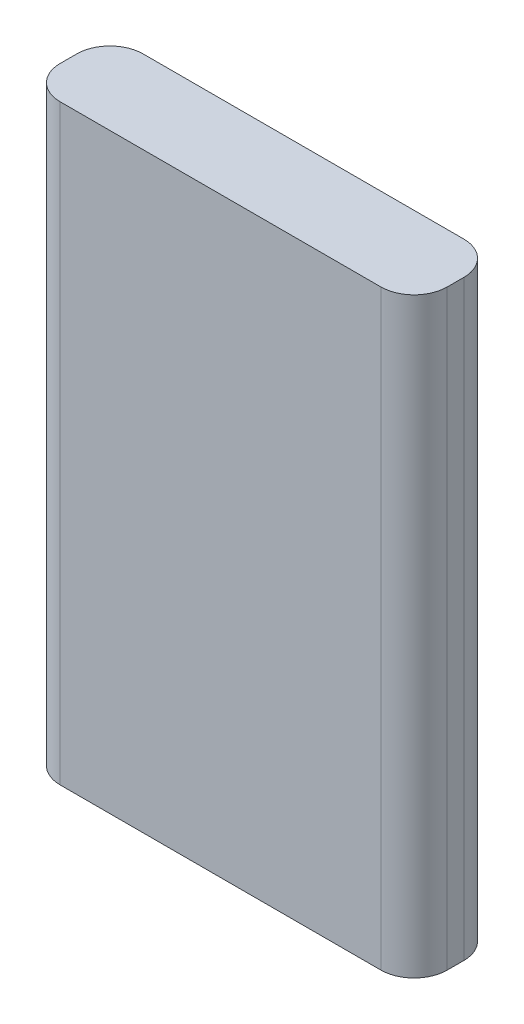
ISO-10303-21;
HEADER;
FILE_DESCRIPTION(('STEP AP214'),'2;1');
FILE_NAME('part.step','',(''),(''),'','','');
FILE_SCHEMA(('AUTOMOTIVE_DESIGN { 1 0 10303 214 1 1 1 1 }'));
ENDSEC;
DATA;
#1=APPLICATION_CONTEXT('core data for automotive mechanical design processes');
#2=APPLICATION_PROTOCOL_DEFINITION('international standard','automotive_design',2000,#1);
#3=PRODUCT_CONTEXT('',#1,'mechanical');
#4=PRODUCT('Part','Part','',(#3));
#5=PRODUCT_RELATED_PRODUCT_CATEGORY('part','',(#4));
#6=PRODUCT_DEFINITION_FORMATION('','',#4);
#7=PRODUCT_DEFINITION_CONTEXT('part definition',#1,'design');
#8=PRODUCT_DEFINITION('design','',#6,#7);
#9=PRODUCT_DEFINITION_SHAPE('','',#8);
#10=(LENGTH_UNIT() NAMED_UNIT(*) SI_UNIT(.MILLI.,.METRE.));
#11=(NAMED_UNIT(*) PLANE_ANGLE_UNIT() SI_UNIT($,.RADIAN.));
#12=(NAMED_UNIT(*) SI_UNIT($,.STERADIAN.) SOLID_ANGLE_UNIT());
#13=UNCERTAINTY_MEASURE_WITH_UNIT(LENGTH_MEASURE(1.E-05),#10,'distance_accuracy_value','');
#14=(GEOMETRIC_REPRESENTATION_CONTEXT(3) GLOBAL_UNCERTAINTY_ASSIGNED_CONTEXT((#13)) GLOBAL_UNIT_ASSIGNED_CONTEXT((#10,
#11,#12)) REPRESENTATION_CONTEXT('',''));
#15=CARTESIAN_POINT('',(0.,0.,0.));
#16=DIRECTION('',(0.,0.,1.));
#17=DIRECTION('',(1.,0.,0.));
#18=AXIS2_PLACEMENT_3D('',#15,#16,#17);
#19=CARTESIAN_POINT('',(-17.5,-26.75,7.5));
#20=DIRECTION('',(1.,0.,0.));
#21=DIRECTION('',(0.,0.,-1.));
#22=AXIS2_PLACEMENT_3D('',#19,#20,#21);
#23=PLANE('',#22);
#24=DIRECTION('',(0.,0.,-1.));
#25=VECTOR('',#24,1.);
#26=CARTESIAN_POINT('',(-17.5,26.75,7.5));
#27=LINE('',#26,#25);
#28=CARTESIAN_POINT('',(-17.5,26.75,4.5));
#29=VERTEX_POINT('',#28);
#30=CARTESIAN_POINT('',(-17.5,26.75,3.));
#31=VERTEX_POINT('',#30);
#32=EDGE_CURVE('E187',#29,#31,#27,.T.);
#33=ORIENTED_EDGE('',*,*,#32,.T.);
#34=DIRECTION('',(0.,-1.,0.));
#35=VECTOR('',#34,1.);
#36=CARTESIAN_POINT('',(-17.5,-26.75,3.));
#37=LINE('',#36,#35);
#38=CARTESIAN_POINT('',(-17.5,-26.75,3.));
#39=VERTEX_POINT('',#38);
#40=EDGE_CURVE('E126',#31,#39,#37,.T.);
#41=ORIENTED_EDGE('',*,*,#40,.T.);
#42=DIRECTION('',(0.,0.,-1.));
#43=VECTOR('',#42,1.);
#44=CARTESIAN_POINT('',(-17.5,-26.75,7.5));
#45=LINE('',#44,#43);
#46=CARTESIAN_POINT('',(-17.5,-26.75,4.5));
#47=VERTEX_POINT('',#46);
#48=EDGE_CURVE('E109',#47,#39,#45,.T.);
#49=ORIENTED_EDGE('',*,*,#48,.F.);
#50=DIRECTION('',(0.,-1.,0.));
#51=VECTOR('',#50,1.);
#52=CARTESIAN_POINT('',(-17.5,26.75,4.5));
#53=LINE('',#52,#51);
#54=EDGE_CURVE('E123',#47,#29,#53,.F.);
#55=ORIENTED_EDGE('',*,*,#54,.T.);
#56=EDGE_LOOP('',(#33,#41,#49,#55));
#57=FACE_BOUND('',#56,.T.);
#58=ADVANCED_FACE('F39',(#57),#23,.F.);
#59=CARTESIAN_POINT('',(17.5,-26.75,7.5));
#60=DIRECTION('',(0.,1.,0.));
#61=DIRECTION('',(-1.,0.,0.));
#62=AXIS2_PLACEMENT_3D('',#59,#60,#61);
#63=PLANE('',#62);
#64=ORIENTED_EDGE('',*,*,#48,.T.);
#65=CARTESIAN_POINT('',(-14.5,-26.75,3.));
#66=DIRECTION('',(0.,1.,0.));
#67=DIRECTION('',(-1.,0.,0.));
#68=AXIS2_PLACEMENT_3D('',#65,#66,#67);
#69=CIRCLE('',#68,3.);
#70=CARTESIAN_POINT('',(-14.5,-26.75,0.));
#71=VERTEX_POINT('',#70);
#72=EDGE_CURVE('E117',#39,#71,#69,.F.);
#73=ORIENTED_EDGE('',*,*,#72,.T.);
#74=DIRECTION('',(1.,0.,0.));
#75=VECTOR('',#74,1.);
#76=CARTESIAN_POINT('',(17.5,-26.75,0.));
#77=LINE('',#76,#75);
#78=CARTESIAN_POINT('',(14.5,-26.75,0.));
#79=VERTEX_POINT('',#78);
#80=EDGE_CURVE('E195',#71,#79,#77,.T.);
#81=ORIENTED_EDGE('',*,*,#80,.T.);
#82=CARTESIAN_POINT('',(14.5,-26.75,3.));
#83=DIRECTION('',(0.,1.,0.));
#84=DIRECTION('',(-1.,0.,0.));
#85=AXIS2_PLACEMENT_3D('',#82,#83,#84);
#86=CIRCLE('',#85,3.);
#87=CARTESIAN_POINT('',(17.5,-26.75,3.));
#88=VERTEX_POINT('',#87);
#89=EDGE_CURVE('E118',#79,#88,#86,.F.);
#90=ORIENTED_EDGE('',*,*,#89,.T.);
#91=DIRECTION('',(0.,0.,-1.));
#92=VECTOR('',#91,1.);
#93=CARTESIAN_POINT('',(17.5,-26.75,7.5));
#94=LINE('',#93,#92);
#95=CARTESIAN_POINT('',(17.5,-26.75,4.5));
#96=VERTEX_POINT('',#95);
#97=EDGE_CURVE('E128',#96,#88,#94,.T.);
#98=ORIENTED_EDGE('',*,*,#97,.F.);
#99=CARTESIAN_POINT('',(14.5,-26.75,4.5));
#100=DIRECTION('',(0.,1.,0.));
#101=DIRECTION('',(-1.,0.,0.));
#102=AXIS2_PLACEMENT_3D('',#99,#100,#101);
#103=CIRCLE('',#102,3.);
#104=CARTESIAN_POINT('',(14.5,-26.75,7.5));
#105=VERTEX_POINT('',#104);
#106=EDGE_CURVE('E136',#96,#105,#103,.F.);
#107=ORIENTED_EDGE('',*,*,#106,.T.);
#108=DIRECTION('',(1.,0.,0.));
#109=VECTOR('',#108,1.);
#110=CARTESIAN_POINT('',(17.5,-26.75,7.5));
#111=LINE('',#110,#109);
#112=CARTESIAN_POINT('',(-14.5,-26.75,7.5));
#113=VERTEX_POINT('',#112);
#114=EDGE_CURVE('E111',#113,#105,#111,.T.);
#115=ORIENTED_EDGE('',*,*,#114,.F.);
#116=CARTESIAN_POINT('',(-14.5,-26.75,4.5));
#117=DIRECTION('',(0.,1.,0.));
#118=DIRECTION('',(-1.,0.,0.));
#119=AXIS2_PLACEMENT_3D('',#116,#117,#118);
#120=CIRCLE('',#119,3.);
#121=EDGE_CURVE('E106',#113,#47,#120,.F.);
#122=ORIENTED_EDGE('',*,*,#121,.T.);
#123=EDGE_LOOP('',(#64,#73,#81,#90,#98,#107,#115,#122));
#124=FACE_BOUND('',#123,.T.);
#125=ADVANCED_FACE('F108',(#124),#63,.F.);
#126=CARTESIAN_POINT('',(17.5,-26.75,7.5));
#127=DIRECTION('',(-1.,0.,0.));
#128=DIRECTION('',(0.,0.,1.));
#129=AXIS2_PLACEMENT_3D('',#126,#127,#128);
#130=PLANE('',#129);
#131=ORIENTED_EDGE('',*,*,#97,.T.);
#132=DIRECTION('',(0.,1.,0.));
#133=VECTOR('',#132,1.);
#134=CARTESIAN_POINT('',(17.5,-26.75,3.));
#135=LINE('',#134,#133);
#136=CARTESIAN_POINT('',(17.5,26.75,3.));
#137=VERTEX_POINT('',#136);
#138=EDGE_CURVE('E11',#88,#137,#135,.T.);
#139=ORIENTED_EDGE('',*,*,#138,.T.);
#140=DIRECTION('',(0.,0.,-1.));
#141=VECTOR('',#140,1.);
#142=CARTESIAN_POINT('',(17.5,26.75,7.5));
#143=LINE('',#142,#141);
#144=CARTESIAN_POINT('',(17.5,26.75,4.5));
#145=VERTEX_POINT('',#144);
#146=EDGE_CURVE('E173',#145,#137,#143,.T.);
#147=ORIENTED_EDGE('',*,*,#146,.F.);
#148=DIRECTION('',(0.,1.,0.));
#149=VECTOR('',#148,1.);
#150=CARTESIAN_POINT('',(17.5,-26.75,4.5));
#151=LINE('',#150,#149);
#152=EDGE_CURVE('E48',#145,#96,#151,.F.);
#153=ORIENTED_EDGE('',*,*,#152,.T.);
#154=EDGE_LOOP('',(#131,#139,#147,#153));
#155=FACE_BOUND('',#154,.T.);
#156=ADVANCED_FACE('F172',(#155),#130,.F.);
#157=CARTESIAN_POINT('',(17.5,26.75,7.5));
#158=DIRECTION('',(0.,-1.,0.));
#159=DIRECTION('',(1.,0.,0.));
#160=AXIS2_PLACEMENT_3D('',#157,#158,#159);
#161=PLANE('',#160);
#162=DIRECTION('',(-1.,0.,0.));
#163=VECTOR('',#162,1.);
#164=CARTESIAN_POINT('',(17.5,26.75,0.));
#165=LINE('',#164,#163);
#166=CARTESIAN_POINT('',(14.5,26.75,0.));
#167=VERTEX_POINT('',#166);
#168=CARTESIAN_POINT('',(-14.5,26.75,0.));
#169=VERTEX_POINT('',#168);
#170=EDGE_CURVE('E192',#167,#169,#165,.T.);
#171=ORIENTED_EDGE('',*,*,#170,.T.);
#172=CARTESIAN_POINT('',(-14.5,26.75,3.));
#173=DIRECTION('',(0.,-1.,0.));
#174=DIRECTION('',(1.,0.,0.));
#175=AXIS2_PLACEMENT_3D('',#172,#173,#174);
#176=CIRCLE('',#175,3.);
#177=EDGE_CURVE('E158',#169,#31,#176,.F.);
#178=ORIENTED_EDGE('',*,*,#177,.T.);
#179=ORIENTED_EDGE('',*,*,#32,.F.);
#180=CARTESIAN_POINT('',(-14.5,26.75,4.5));
#181=DIRECTION('',(0.,-1.,0.));
#182=DIRECTION('',(1.,0.,0.));
#183=AXIS2_PLACEMENT_3D('',#180,#181,#182);
#184=CIRCLE('',#183,3.);
#185=CARTESIAN_POINT('',(-14.5,26.75,7.5));
#186=VERTEX_POINT('',#185);
#187=EDGE_CURVE('E132',#29,#186,#184,.F.);
#188=ORIENTED_EDGE('',*,*,#187,.T.);
#189=DIRECTION('',(-1.,0.,0.));
#190=VECTOR('',#189,1.);
#191=CARTESIAN_POINT('',(17.5,26.75,7.5));
#192=LINE('',#191,#190);
#193=CARTESIAN_POINT('',(14.5,26.75,7.5));
#194=VERTEX_POINT('',#193);
#195=EDGE_CURVE('E183',#194,#186,#192,.T.);
#196=ORIENTED_EDGE('',*,*,#195,.F.);
#197=CARTESIAN_POINT('',(14.5,26.75,4.5));
#198=DIRECTION('',(0.,-1.,0.));
#199=DIRECTION('',(1.,0.,0.));
#200=AXIS2_PLACEMENT_3D('',#197,#198,#199);
#201=CIRCLE('',#200,3.);
#202=EDGE_CURVE('E62',#194,#145,#201,.F.);
#203=ORIENTED_EDGE('',*,*,#202,.T.);
#204=ORIENTED_EDGE('',*,*,#146,.T.);
#205=CARTESIAN_POINT('',(14.5,26.75,3.));
#206=DIRECTION('',(0.,-1.,0.));
#207=DIRECTION('',(1.,0.,0.));
#208=AXIS2_PLACEMENT_3D('',#205,#206,#207);
#209=CIRCLE('',#208,3.);
#210=EDGE_CURVE('E55',#137,#167,#209,.F.);
#211=ORIENTED_EDGE('',*,*,#210,.T.);
#212=EDGE_LOOP('',(#171,#178,#179,#188,#196,#203,#204,#211));
#213=FACE_BOUND('',#212,.T.);
#214=ADVANCED_FACE('F185',(#213),#161,.F.);
#215=CARTESIAN_POINT('',(0.,0.,7.5));
#216=DIRECTION('',(0.,0.,1.));
#217=DIRECTION('',(1.,0.,0.));
#218=AXIS2_PLACEMENT_3D('',#215,#216,#217);
#219=PLANE('',#218);
#220=ORIENTED_EDGE('',*,*,#195,.T.);
#221=DIRECTION('',(0.,-1.,0.));
#222=VECTOR('',#221,1.);
#223=CARTESIAN_POINT('',(-14.5,-26.75,7.5));
#224=LINE('',#223,#222);
#225=EDGE_CURVE('E165',#186,#113,#224,.T.);
#226=ORIENTED_EDGE('',*,*,#225,.T.);
#227=ORIENTED_EDGE('',*,*,#114,.T.);
#228=DIRECTION('',(0.,1.,0.));
#229=VECTOR('',#228,1.);
#230=CARTESIAN_POINT('',(14.5,26.75,7.5));
#231=LINE('',#230,#229);
#232=EDGE_CURVE('E161',#105,#194,#231,.T.);
#233=ORIENTED_EDGE('',*,*,#232,.T.);
#234=EDGE_LOOP('',(#220,#226,#227,#233));
#235=FACE_BOUND('',#234,.T.);
#236=ADVANCED_FACE('F182',(#235),#219,.T.);
#237=CARTESIAN_POINT('',(0.,0.,0.));
#238=DIRECTION('',(0.,0.,1.));
#239=DIRECTION('',(1.,0.,0.));
#240=AXIS2_PLACEMENT_3D('',#237,#238,#239);
#241=PLANE('',#240);
#242=ORIENTED_EDGE('',*,*,#80,.F.);
#243=DIRECTION('',(0.,-1.,0.));
#244=VECTOR('',#243,1.);
#245=CARTESIAN_POINT('',(-14.5,0.,0.));
#246=LINE('',#245,#244);
#247=EDGE_CURVE('E149',#71,#169,#246,.F.);
#248=ORIENTED_EDGE('',*,*,#247,.T.);
#249=ORIENTED_EDGE('',*,*,#170,.F.);
#250=DIRECTION('',(0.,1.,0.));
#251=VECTOR('',#250,1.);
#252=CARTESIAN_POINT('',(14.5,0.,0.));
#253=LINE('',#252,#251);
#254=EDGE_CURVE('E146',#167,#79,#253,.F.);
#255=ORIENTED_EDGE('',*,*,#254,.T.);
#256=EDGE_LOOP('',(#242,#248,#249,#255));
#257=FACE_BOUND('',#256,.T.);
#258=ADVANCED_FACE('F205',(#257),#241,.F.);
#259=CARTESIAN_POINT('',(-14.5,-26.75,3.));
#260=DIRECTION('',(0.,-1.,0.));
#261=DIRECTION('',(0.,0.,-1.));
#262=AXIS2_PLACEMENT_3D('',#259,#260,#261);
#263=CYLINDRICAL_SURFACE('',#262,3.);
#264=ORIENTED_EDGE('',*,*,#177,.F.);
#265=ORIENTED_EDGE('',*,*,#247,.F.);
#266=ORIENTED_EDGE('',*,*,#72,.F.);
#267=ORIENTED_EDGE('',*,*,#40,.F.);
#268=EDGE_LOOP('',(#264,#265,#266,#267));
#269=FACE_BOUND('',#268,.T.);
#270=ADVANCED_FACE('F213',(#269),#263,.T.);
#271=CARTESIAN_POINT('',(-14.5,0.,4.5));
#272=DIRECTION('',(0.,1.,0.));
#273=DIRECTION('',(0.,0.,1.));
#274=AXIS2_PLACEMENT_3D('',#271,#272,#273);
#275=CYLINDRICAL_SURFACE('',#274,3.);
#276=ORIENTED_EDGE('',*,*,#187,.F.);
#277=ORIENTED_EDGE('',*,*,#54,.F.);
#278=ORIENTED_EDGE('',*,*,#121,.F.);
#279=ORIENTED_EDGE('',*,*,#225,.F.);
#280=EDGE_LOOP('',(#276,#277,#278,#279));
#281=FACE_BOUND('',#280,.T.);
#282=ADVANCED_FACE('F131',(#281),#275,.T.);
#283=CARTESIAN_POINT('',(14.5,-26.75,3.));
#284=DIRECTION('',(0.,1.,0.));
#285=DIRECTION('',(0.,0.,1.));
#286=AXIS2_PLACEMENT_3D('',#283,#284,#285);
#287=CYLINDRICAL_SURFACE('',#286,3.);
#288=ORIENTED_EDGE('',*,*,#89,.F.);
#289=ORIENTED_EDGE('',*,*,#254,.F.);
#290=ORIENTED_EDGE('',*,*,#210,.F.);
#291=ORIENTED_EDGE('',*,*,#138,.F.);
#292=EDGE_LOOP('',(#288,#289,#290,#291));
#293=FACE_BOUND('',#292,.T.);
#294=ADVANCED_FACE('F207',(#293),#287,.T.);
#295=CARTESIAN_POINT('',(14.5,0.,4.5));
#296=DIRECTION('',(0.,-1.,0.));
#297=DIRECTION('',(0.,0.,-1.));
#298=AXIS2_PLACEMENT_3D('',#295,#296,#297);
#299=CYLINDRICAL_SURFACE('',#298,3.);
#300=ORIENTED_EDGE('',*,*,#106,.F.);
#301=ORIENTED_EDGE('',*,*,#152,.F.);
#302=ORIENTED_EDGE('',*,*,#202,.F.);
#303=ORIENTED_EDGE('',*,*,#232,.F.);
#304=EDGE_LOOP('',(#300,#301,#302,#303));
#305=FACE_BOUND('',#304,.T.);
#306=ADVANCED_FACE('F41',(#305),#299,.T.);
#307=CLOSED_SHELL('',(#58,#125,#156,#214,#236,#258,#270,#282,#294,#306));
#308=MANIFOLD_SOLID_BREP('B2',#307);
#309=ADVANCED_BREP_SHAPE_REPRESENTATION('',(#18,#308),#14);
#310=SHAPE_DEFINITION_REPRESENTATION(#9,#309);
ENDSEC;
END-ISO-10303-21;
